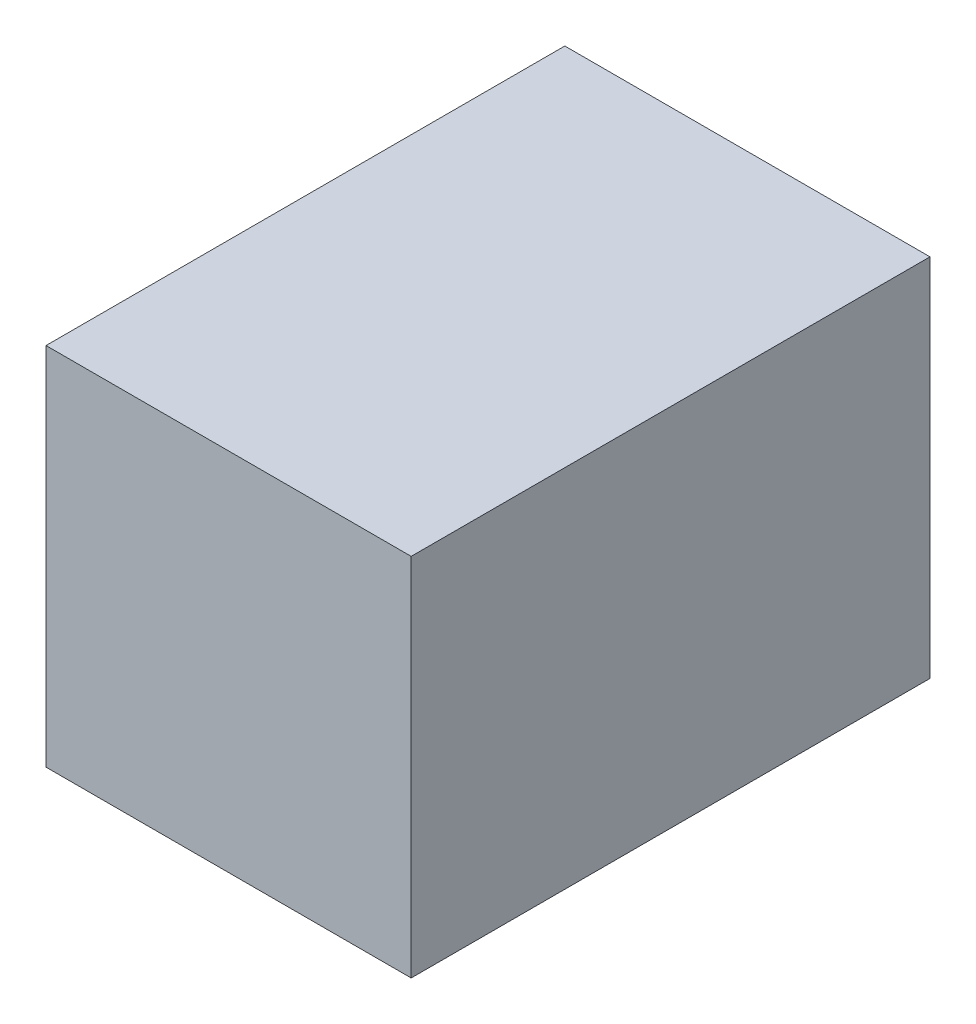
ISO-10303-21;
HEADER;
FILE_DESCRIPTION(('STEP AP214'),'2;1');
FILE_NAME('part.step','',(''),(''),'','','');
FILE_SCHEMA(('AUTOMOTIVE_DESIGN { 1 0 10303 214 1 1 1 1 }'));
ENDSEC;
DATA;
#1=APPLICATION_CONTEXT('core data for automotive mechanical design processes');
#2=APPLICATION_PROTOCOL_DEFINITION('international standard','automotive_design',2000,#1);
#3=PRODUCT_CONTEXT('',#1,'mechanical');
#4=PRODUCT('Part','Part','',(#3));
#5=PRODUCT_RELATED_PRODUCT_CATEGORY('part','',(#4));
#6=PRODUCT_DEFINITION_FORMATION('','',#4);
#7=PRODUCT_DEFINITION_CONTEXT('part definition',#1,'design');
#8=PRODUCT_DEFINITION('design','',#6,#7);
#9=PRODUCT_DEFINITION_SHAPE('','',#8);
#10=(LENGTH_UNIT() NAMED_UNIT(*) SI_UNIT(.MILLI.,.METRE.));
#11=(NAMED_UNIT(*) PLANE_ANGLE_UNIT() SI_UNIT($,.RADIAN.));
#12=(NAMED_UNIT(*) SI_UNIT($,.STERADIAN.) SOLID_ANGLE_UNIT());
#13=UNCERTAINTY_MEASURE_WITH_UNIT(LENGTH_MEASURE(1.E-05),#10,'distance_accuracy_value','');
#14=(GEOMETRIC_REPRESENTATION_CONTEXT(3) GLOBAL_UNCERTAINTY_ASSIGNED_CONTEXT((#13)) GLOBAL_UNIT_ASSIGNED_CONTEXT((#10,
#11,#12)) REPRESENTATION_CONTEXT('',''));
#15=CARTESIAN_POINT('',(0.,0.,0.));
#16=DIRECTION('',(0.,0.,1.));
#17=DIRECTION('',(1.,0.,0.));
#18=AXIS2_PLACEMENT_3D('',#15,#16,#17);
#19=CARTESIAN_POINT('',(0.,0.,28.414709848079));
#20=DIRECTION('',(1.,0.,0.));
#21=DIRECTION('',(0.,0.,-1.));
#22=AXIS2_PLACEMENT_3D('',#19,#20,#21);
#23=PLANE('',#22);
#24=DIRECTION('',(0.,-1.,0.));
#25=VECTOR('',#24,1.);
#26=CARTESIAN_POINT('',(0.,0.,0.));
#27=LINE('',#26,#25);
#28=CARTESIAN_POINT('',(0.,20.,0.));
#29=VERTEX_POINT('',#28);
#30=CARTESIAN_POINT('',(0.,0.,0.));
#31=VERTEX_POINT('',#30);
#32=EDGE_CURVE('E98',#29,#31,#27,.T.);
#33=ORIENTED_EDGE('',*,*,#32,.T.);
#34=DIRECTION('',(0.,0.,-1.));
#35=VECTOR('',#34,1.);
#36=CARTESIAN_POINT('',(0.,0.,28.414709848079));
#37=LINE('',#36,#35);
#38=CARTESIAN_POINT('',(0.,0.,28.414709848079));
#39=VERTEX_POINT('',#38);
#40=EDGE_CURVE('E11',#39,#31,#37,.T.);
#41=ORIENTED_EDGE('',*,*,#40,.F.);
#42=DIRECTION('',(0.,-1.,0.));
#43=VECTOR('',#42,1.);
#44=CARTESIAN_POINT('',(0.,0.,28.414709848079));
#45=LINE('',#44,#43);
#46=CARTESIAN_POINT('',(0.,20.,28.414709848079));
#47=VERTEX_POINT('',#46);
#48=EDGE_CURVE('E86',#47,#39,#45,.T.);
#49=ORIENTED_EDGE('',*,*,#48,.F.);
#50=DIRECTION('',(0.,0.,-1.));
#51=VECTOR('',#50,1.);
#52=CARTESIAN_POINT('',(0.,20.,28.414709848079));
#53=LINE('',#52,#51);
#54=EDGE_CURVE('E94',#47,#29,#53,.T.);
#55=ORIENTED_EDGE('',*,*,#54,.T.);
#56=EDGE_LOOP('',(#33,#41,#49,#55));
#57=FACE_BOUND('',#56,.T.);
#58=ADVANCED_FACE('F35',(#57),#23,.F.);
#59=CARTESIAN_POINT('',(0.,0.,28.414709848079));
#60=DIRECTION('',(0.,1.,0.));
#61=DIRECTION('',(0.,0.,1.));
#62=AXIS2_PLACEMENT_3D('',#59,#60,#61);
#63=PLANE('',#62);
#64=DIRECTION('',(1.,0.,0.));
#65=VECTOR('',#64,1.);
#66=CARTESIAN_POINT('',(0.,0.,0.));
#67=LINE('',#66,#65);
#68=CARTESIAN_POINT('',(20.,0.,0.));
#69=VERTEX_POINT('',#68);
#70=EDGE_CURVE('E90',#31,#69,#67,.T.);
#71=ORIENTED_EDGE('',*,*,#70,.T.);
#72=DIRECTION('',(0.,0.,-1.));
#73=VECTOR('',#72,1.);
#74=CARTESIAN_POINT('',(20.,0.,28.414709848079));
#75=LINE('',#74,#73);
#76=CARTESIAN_POINT('',(20.,0.,28.414709848079));
#77=VERTEX_POINT('',#76);
#78=EDGE_CURVE('E43',#77,#69,#75,.T.);
#79=ORIENTED_EDGE('',*,*,#78,.F.);
#80=DIRECTION('',(1.,0.,0.));
#81=VECTOR('',#80,1.);
#82=CARTESIAN_POINT('',(0.,0.,28.414709848079));
#83=LINE('',#82,#81);
#84=EDGE_CURVE('E81',#39,#77,#83,.T.);
#85=ORIENTED_EDGE('',*,*,#84,.F.);
#86=ORIENTED_EDGE('',*,*,#40,.T.);
#87=EDGE_LOOP('',(#71,#79,#85,#86));
#88=FACE_BOUND('',#87,.T.);
#89=ADVANCED_FACE('F89',(#88),#63,.F.);
#90=CARTESIAN_POINT('',(20.,0.,28.414709848079));
#91=DIRECTION('',(-1.,0.,0.));
#92=DIRECTION('',(0.,0.,1.));
#93=AXIS2_PLACEMENT_3D('',#90,#91,#92);
#94=PLANE('',#93);
#95=DIRECTION('',(0.,1.,0.));
#96=VECTOR('',#95,1.);
#97=CARTESIAN_POINT('',(20.,0.,0.));
#98=LINE('',#97,#96);
#99=CARTESIAN_POINT('',(20.,20.,0.));
#100=VERTEX_POINT('',#99);
#101=EDGE_CURVE('E68',#69,#100,#98,.T.);
#102=ORIENTED_EDGE('',*,*,#101,.T.);
#103=DIRECTION('',(0.,0.,-1.));
#104=VECTOR('',#103,1.);
#105=CARTESIAN_POINT('',(20.,20.,28.414709848079));
#106=LINE('',#105,#104);
#107=CARTESIAN_POINT('',(20.,20.,28.414709848079));
#108=VERTEX_POINT('',#107);
#109=EDGE_CURVE('E91',#108,#100,#106,.T.);
#110=ORIENTED_EDGE('',*,*,#109,.F.);
#111=DIRECTION('',(0.,1.,0.));
#112=VECTOR('',#111,1.);
#113=CARTESIAN_POINT('',(20.,0.,28.414709848079));
#114=LINE('',#113,#112);
#115=EDGE_CURVE('E84',#77,#108,#114,.T.);
#116=ORIENTED_EDGE('',*,*,#115,.F.);
#117=ORIENTED_EDGE('',*,*,#78,.T.);
#118=EDGE_LOOP('',(#102,#110,#116,#117));
#119=FACE_BOUND('',#118,.T.);
#120=ADVANCED_FACE('F92',(#119),#94,.F.);
#121=CARTESIAN_POINT('',(0.,20.,28.414709848079));
#122=DIRECTION('',(0.,-1.,0.));
#123=DIRECTION('',(0.,0.,-1.));
#124=AXIS2_PLACEMENT_3D('',#121,#122,#123);
#125=PLANE('',#124);
#126=DIRECTION('',(-1.,0.,0.));
#127=VECTOR('',#126,1.);
#128=CARTESIAN_POINT('',(0.,20.,0.));
#129=LINE('',#128,#127);
#130=EDGE_CURVE('E74',#100,#29,#129,.T.);
#131=ORIENTED_EDGE('',*,*,#130,.T.);
#132=ORIENTED_EDGE('',*,*,#54,.F.);
#133=DIRECTION('',(-1.,0.,0.));
#134=VECTOR('',#133,1.);
#135=CARTESIAN_POINT('',(0.,20.,28.414709848079));
#136=LINE('',#135,#134);
#137=EDGE_CURVE('E51',#108,#47,#136,.T.);
#138=ORIENTED_EDGE('',*,*,#137,.F.);
#139=ORIENTED_EDGE('',*,*,#109,.T.);
#140=EDGE_LOOP('',(#131,#132,#138,#139));
#141=FACE_BOUND('',#140,.T.);
#142=ADVANCED_FACE('F105',(#141),#125,.F.);
#143=CARTESIAN_POINT('',(0.,0.,28.414709848079));
#144=DIRECTION('',(0.,0.,-1.));
#145=DIRECTION('',(-1.,0.,0.));
#146=AXIS2_PLACEMENT_3D('',#143,#144,#145);
#147=PLANE('',#146);
#148=ORIENTED_EDGE('',*,*,#48,.T.);
#149=ORIENTED_EDGE('',*,*,#84,.T.);
#150=ORIENTED_EDGE('',*,*,#115,.T.);
#151=ORIENTED_EDGE('',*,*,#137,.T.);
#152=EDGE_LOOP('',(#148,#149,#150,#151));
#153=FACE_BOUND('',#152,.T.);
#154=ADVANCED_FACE('F82',(#153),#147,.F.);
#155=CARTESIAN_POINT('',(0.,0.,0.));
#156=DIRECTION('',(0.,0.,-1.));
#157=DIRECTION('',(-1.,0.,0.));
#158=AXIS2_PLACEMENT_3D('',#155,#156,#157);
#159=PLANE('',#158);
#160=ORIENTED_EDGE('',*,*,#32,.F.);
#161=ORIENTED_EDGE('',*,*,#130,.F.);
#162=ORIENTED_EDGE('',*,*,#101,.F.);
#163=ORIENTED_EDGE('',*,*,#70,.F.);
#164=EDGE_LOOP('',(#160,#161,#162,#163));
#165=FACE_BOUND('',#164,.T.);
#166=ADVANCED_FACE('F108',(#165),#159,.T.);
#167=CLOSED_SHELL('',(#58,#89,#120,#142,#154,#166));
#168=MANIFOLD_SOLID_BREP('B2',#167);
#169=ADVANCED_BREP_SHAPE_REPRESENTATION('',(#18,#168),#14);
#170=SHAPE_DEFINITION_REPRESENTATION(#9,#169);
ENDSEC;
END-ISO-10303-21;
